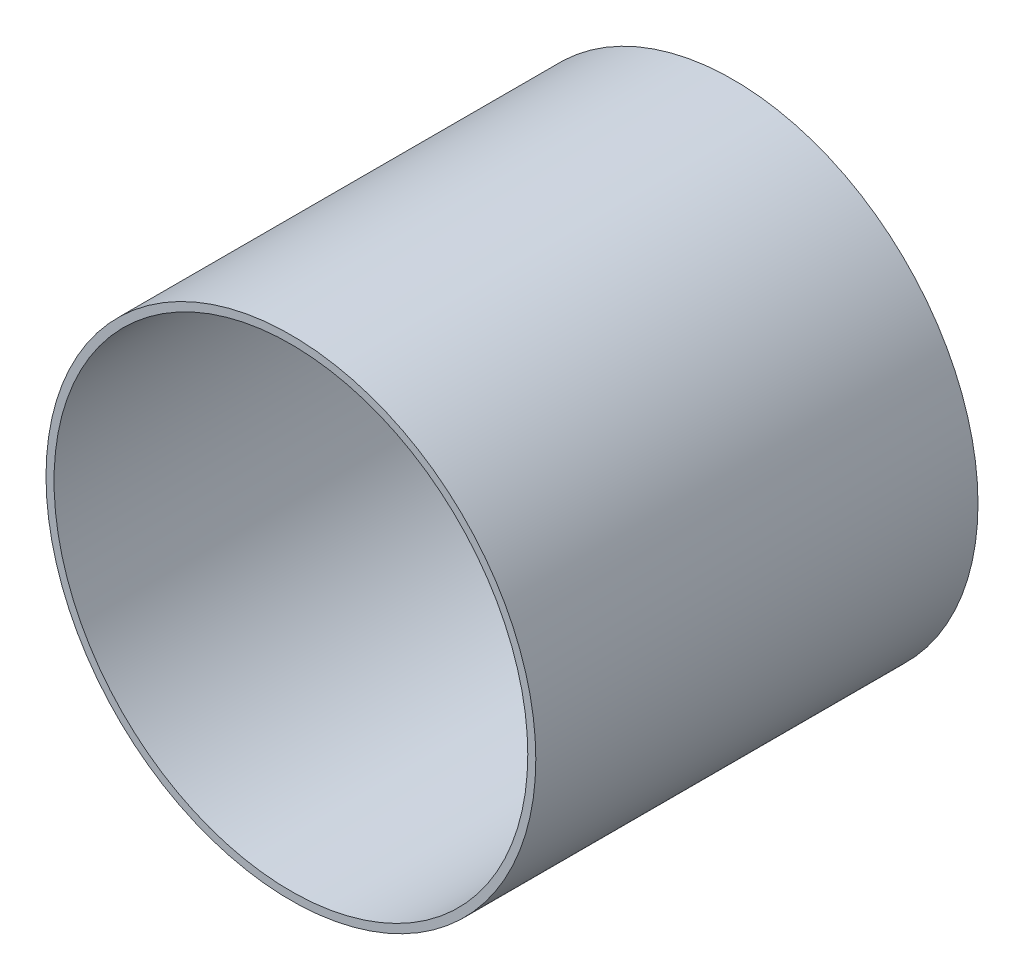
ISO-10303-21;
HEADER;
FILE_DESCRIPTION(('STEP AP214'),'2;1');
FILE_NAME('part.step','',(''),(''),'','','');
FILE_SCHEMA(('AUTOMOTIVE_DESIGN { 1 0 10303 214 1 1 1 1 }'));
ENDSEC;
DATA;
#1=APPLICATION_CONTEXT('core data for automotive mechanical design processes');
#2=APPLICATION_PROTOCOL_DEFINITION('international standard','automotive_design',2000,#1);
#3=PRODUCT_CONTEXT('',#1,'mechanical');
#4=PRODUCT('Part','Part','',(#3));
#5=PRODUCT_RELATED_PRODUCT_CATEGORY('part','',(#4));
#6=PRODUCT_DEFINITION_FORMATION('','',#4);
#7=PRODUCT_DEFINITION_CONTEXT('part definition',#1,'design');
#8=PRODUCT_DEFINITION('design','',#6,#7);
#9=PRODUCT_DEFINITION_SHAPE('','',#8);
#10=(LENGTH_UNIT() NAMED_UNIT(*) SI_UNIT(.MILLI.,.METRE.));
#11=(NAMED_UNIT(*) PLANE_ANGLE_UNIT() SI_UNIT($,.RADIAN.));
#12=(NAMED_UNIT(*) SI_UNIT($,.STERADIAN.) SOLID_ANGLE_UNIT());
#13=UNCERTAINTY_MEASURE_WITH_UNIT(LENGTH_MEASURE(1.E-05),#10,'distance_accuracy_value','');
#14=(GEOMETRIC_REPRESENTATION_CONTEXT(3) GLOBAL_UNCERTAINTY_ASSIGNED_CONTEXT((#13)) GLOBAL_UNIT_ASSIGNED_CONTEXT((#10,
#11,#12)) REPRESENTATION_CONTEXT('',''));
#15=CARTESIAN_POINT('',(0.,0.,0.));
#16=DIRECTION('',(0.,0.,1.));
#17=DIRECTION('',(1.,0.,0.));
#18=AXIS2_PLACEMENT_3D('',#15,#16,#17);
#19=CARTESIAN_POINT('',(0.,0.,0.));
#20=DIRECTION('',(0.,0.,-1.));
#21=DIRECTION('',(1.,0.,0.));
#22=AXIS2_PLACEMENT_3D('',#19,#20,#21);
#23=CYLINDRICAL_SURFACE('',#22,0.7753985);
#24=CARTESIAN_POINT('',(0.,0.,1.39999974));
#25=DIRECTION('',(0.,0.,1.));
#26=DIRECTION('',(1.,0.,0.));
#27=AXIS2_PLACEMENT_3D('',#24,#25,#26);
#28=CIRCLE('',#27,0.7753985);
#29=CARTESIAN_POINT('',(0.7753985,0.,1.39999974));
#30=VERTEX_POINT('',#29);
#31=EDGE_CURVE('E11',#30,#30,#28,.T.);
#32=ORIENTED_EDGE('',*,*,#31,.F.);
#33=DIRECTION('',(0.,0.,1.));
#34=VECTOR('',#33,1.);
#35=CARTESIAN_POINT('',(0.7753985,0.,0.));
#36=LINE('',#35,#34);
#37=CARTESIAN_POINT('',(0.7753985,0.,0.));
#38=VERTEX_POINT('',#37);
#39=EDGE_CURVE('E24',#38,#30,#36,.T.);
#40=ORIENTED_EDGE('',*,*,#39,.F.);
#41=CARTESIAN_POINT('',(0.,0.,0.));
#42=DIRECTION('',(0.,0.,1.));
#43=DIRECTION('',(1.,0.,0.));
#44=AXIS2_PLACEMENT_3D('',#41,#42,#43);
#45=CIRCLE('',#44,0.7753985);
#46=EDGE_CURVE('E46',#38,#38,#45,.T.);
#47=ORIENTED_EDGE('',*,*,#46,.T.);
#48=ORIENTED_EDGE('',*,*,#39,.T.);
#49=EDGE_LOOP('',(#32,#40,#47,#48));
#50=FACE_BOUND('',#49,.T.);
#51=ADVANCED_FACE('F17',(#50),#23,.T.);
#52=CARTESIAN_POINT('',(0.,0.,0.));
#53=DIRECTION('',(0.,0.,-1.));
#54=DIRECTION('',(1.,0.,0.));
#55=AXIS2_PLACEMENT_3D('',#52,#53,#54);
#56=CYLINDRICAL_SURFACE('',#55,0.7499985);
#57=DIRECTION('',(0.,0.,1.));
#58=VECTOR('',#57,1.);
#59=CARTESIAN_POINT('',(0.7499985,0.,0.));
#60=LINE('',#59,#58);
#61=CARTESIAN_POINT('',(0.7499985,0.,0.));
#62=VERTEX_POINT('',#61);
#63=CARTESIAN_POINT('',(0.7499985,0.,1.39999974));
#64=VERTEX_POINT('',#63);
#65=EDGE_CURVE('E40',#62,#64,#60,.T.);
#66=ORIENTED_EDGE('',*,*,#65,.T.);
#67=CARTESIAN_POINT('',(0.,0.,1.39999974));
#68=DIRECTION('',(0.,0.,1.));
#69=DIRECTION('',(1.,0.,0.));
#70=AXIS2_PLACEMENT_3D('',#67,#68,#69);
#71=CIRCLE('',#70,0.7499985);
#72=EDGE_CURVE('E45',#64,#64,#71,.T.);
#73=ORIENTED_EDGE('',*,*,#72,.T.);
#74=ORIENTED_EDGE('',*,*,#65,.F.);
#75=CARTESIAN_POINT('',(0.,0.,0.));
#76=DIRECTION('',(0.,0.,1.));
#77=DIRECTION('',(1.,0.,0.));
#78=AXIS2_PLACEMENT_3D('',#75,#76,#77);
#79=CIRCLE('',#78,0.7499985);
#80=EDGE_CURVE('E43',#62,#62,#79,.T.);
#81=ORIENTED_EDGE('',*,*,#80,.F.);
#82=EDGE_LOOP('',(#66,#73,#74,#81));
#83=FACE_BOUND('',#82,.T.);
#84=ADVANCED_FACE('F42',(#83),#56,.F.);
#85=CARTESIAN_POINT('',(0.7753985,0.,0.));
#86=DIRECTION('',(0.,0.,-1.));
#87=DIRECTION('',(-1.,0.,0.));
#88=AXIS2_PLACEMENT_3D('',#85,#86,#87);
#89=PLANE('',#88);
#90=ORIENTED_EDGE('',*,*,#46,.F.);
#91=EDGE_LOOP('',(#90));
#92=FACE_BOUND('',#91,.T.);
#93=ORIENTED_EDGE('',*,*,#80,.T.);
#94=EDGE_LOOP('',(#93));
#95=FACE_BOUND('',#94,.T.);
#96=ADVANCED_FACE('F49',(#92,#95),#89,.T.);
#97=CARTESIAN_POINT('',(0.7753985,0.,1.39999974));
#98=DIRECTION('',(0.,0.,-1.));
#99=DIRECTION('',(-1.,0.,0.));
#100=AXIS2_PLACEMENT_3D('',#97,#98,#99);
#101=PLANE('',#100);
#102=ORIENTED_EDGE('',*,*,#31,.T.);
#103=EDGE_LOOP('',(#102));
#104=FACE_BOUND('',#103,.T.);
#105=ORIENTED_EDGE('',*,*,#72,.F.);
#106=EDGE_LOOP('',(#105));
#107=FACE_BOUND('',#106,.T.);
#108=ADVANCED_FACE('F56',(#104,#107),#101,.F.);
#109=CLOSED_SHELL('',(#51,#84,#96,#108));
#110=MANIFOLD_SOLID_BREP('B1',#109);
#111=ADVANCED_BREP_SHAPE_REPRESENTATION('',(#18,#110),#14);
#112=SHAPE_DEFINITION_REPRESENTATION(#9,#111);
ENDSEC;
END-ISO-10303-21;
